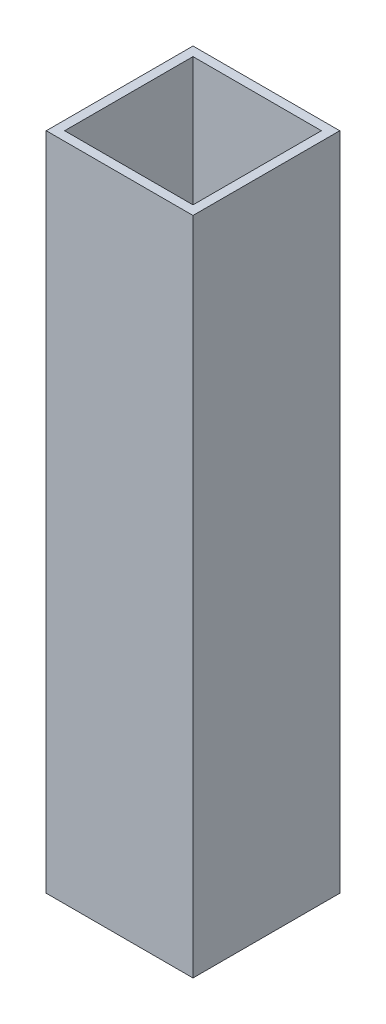
ISO-10303-21;
HEADER;
FILE_DESCRIPTION(('STEP AP214'),'2;1');
FILE_NAME('part.step','',(''),(''),'','','');
FILE_SCHEMA(('AUTOMOTIVE_DESIGN { 1 0 10303 214 1 1 1 1 }'));
ENDSEC;
DATA;
#1=APPLICATION_CONTEXT('core data for automotive mechanical design processes');
#2=APPLICATION_PROTOCOL_DEFINITION('international standard','automotive_design',2000,#1);
#3=PRODUCT_CONTEXT('',#1,'mechanical');
#4=PRODUCT('Part','Part','',(#3));
#5=PRODUCT_RELATED_PRODUCT_CATEGORY('part','',(#4));
#6=PRODUCT_DEFINITION_FORMATION('','',#4);
#7=PRODUCT_DEFINITION_CONTEXT('part definition',#1,'design');
#8=PRODUCT_DEFINITION('design','',#6,#7);
#9=PRODUCT_DEFINITION_SHAPE('','',#8);
#10=(LENGTH_UNIT() NAMED_UNIT(*) SI_UNIT(.MILLI.,.METRE.));
#11=(NAMED_UNIT(*) PLANE_ANGLE_UNIT() SI_UNIT($,.RADIAN.));
#12=(NAMED_UNIT(*) SI_UNIT($,.STERADIAN.) SOLID_ANGLE_UNIT());
#13=UNCERTAINTY_MEASURE_WITH_UNIT(LENGTH_MEASURE(1.E-05),#10,'distance_accuracy_value','');
#14=(GEOMETRIC_REPRESENTATION_CONTEXT(3) GLOBAL_UNCERTAINTY_ASSIGNED_CONTEXT((#13)) GLOBAL_UNIT_ASSIGNED_CONTEXT((#10,
#11,#12)) REPRESENTATION_CONTEXT('',''));
#15=CARTESIAN_POINT('',(0.,0.,0.));
#16=DIRECTION('',(0.,0.,1.));
#17=DIRECTION('',(1.,0.,0.));
#18=AXIS2_PLACEMENT_3D('',#15,#16,#17);
#19=CARTESIAN_POINT('',(0.,114.3,0.));
#20=DIRECTION('',(0.,-1.,0.));
#21=DIRECTION('',(0.,0.,-1.));
#22=AXIS2_PLACEMENT_3D('',#19,#20,#21);
#23=PLANE('',#22);
#24=DIRECTION('',(0.,0.,-1.));
#25=VECTOR('',#24,1.);
#26=CARTESIAN_POINT('',(12.7,114.3,12.7));
#27=LINE('',#26,#25);
#28=CARTESIAN_POINT('',(12.7,114.3,12.7));
#29=VERTEX_POINT('',#28);
#30=CARTESIAN_POINT('',(12.7,114.3,-12.7));
#31=VERTEX_POINT('',#30);
#32=EDGE_CURVE('E135',#29,#31,#27,.T.);
#33=ORIENTED_EDGE('',*,*,#32,.T.);
#34=DIRECTION('',(-1.,0.,0.));
#35=VECTOR('',#34,1.);
#36=CARTESIAN_POINT('',(-12.7,114.3,-12.7));
#37=LINE('',#36,#35);
#38=CARTESIAN_POINT('',(-12.7,114.3,-12.7));
#39=VERTEX_POINT('',#38);
#40=EDGE_CURVE('E138',#31,#39,#37,.T.);
#41=ORIENTED_EDGE('',*,*,#40,.T.);
#42=DIRECTION('',(0.,0.,1.));
#43=VECTOR('',#42,1.);
#44=CARTESIAN_POINT('',(-12.7,114.3,12.7));
#45=LINE('',#44,#43);
#46=CARTESIAN_POINT('',(-12.7,114.3,12.7));
#47=VERTEX_POINT('',#46);
#48=EDGE_CURVE('E141',#39,#47,#45,.T.);
#49=ORIENTED_EDGE('',*,*,#48,.T.);
#50=DIRECTION('',(1.,0.,0.));
#51=VECTOR('',#50,1.);
#52=CARTESIAN_POINT('',(-12.7,114.3,12.7));
#53=LINE('',#52,#51);
#54=EDGE_CURVE('E143',#47,#29,#53,.T.);
#55=ORIENTED_EDGE('',*,*,#54,.T.);
#56=EDGE_LOOP('',(#33,#41,#49,#55));
#57=FACE_BOUND('',#56,.T.);
#58=DIRECTION('',(0.,0.,-1.));
#59=VECTOR('',#58,1.);
#60=CARTESIAN_POINT('',(11.1125,114.3,11.1125));
#61=LINE('',#60,#59);
#62=CARTESIAN_POINT('',(11.1125,114.3,11.1125));
#63=VERTEX_POINT('',#62);
#64=CARTESIAN_POINT('',(11.1125,114.3,-11.1125));
#65=VERTEX_POINT('',#64);
#66=EDGE_CURVE('E99',#63,#65,#61,.T.);
#67=ORIENTED_EDGE('',*,*,#66,.F.);
#68=DIRECTION('',(1.,0.,0.));
#69=VECTOR('',#68,1.);
#70=CARTESIAN_POINT('',(-11.1125,114.3,11.1125));
#71=LINE('',#70,#69);
#72=CARTESIAN_POINT('',(-11.1125,114.3,11.1125));
#73=VERTEX_POINT('',#72);
#74=EDGE_CURVE('E121',#73,#63,#71,.T.);
#75=ORIENTED_EDGE('',*,*,#74,.F.);
#76=DIRECTION('',(0.,0.,1.));
#77=VECTOR('',#76,1.);
#78=CARTESIAN_POINT('',(-11.1125,114.3,11.1125));
#79=LINE('',#78,#77);
#80=CARTESIAN_POINT('',(-11.1125,114.3,-11.1125));
#81=VERTEX_POINT('',#80);
#82=EDGE_CURVE('E119',#81,#73,#79,.T.);
#83=ORIENTED_EDGE('',*,*,#82,.F.);
#84=DIRECTION('',(-1.,0.,0.));
#85=VECTOR('',#84,1.);
#86=CARTESIAN_POINT('',(-11.1125,114.3,-11.1125));
#87=LINE('',#86,#85);
#88=EDGE_CURVE('E107',#65,#81,#87,.T.);
#89=ORIENTED_EDGE('',*,*,#88,.F.);
#90=EDGE_LOOP('',(#67,#75,#83,#89));
#91=FACE_BOUND('',#90,.T.);
#92=ADVANCED_FACE('F34',(#57,#91),#23,.F.);
#93=CARTESIAN_POINT('',(0.,0.,0.));
#94=DIRECTION('',(0.,-1.,0.));
#95=DIRECTION('',(0.,0.,-1.));
#96=AXIS2_PLACEMENT_3D('',#93,#94,#95);
#97=PLANE('',#96);
#98=DIRECTION('',(0.,0.,-1.));
#99=VECTOR('',#98,1.);
#100=CARTESIAN_POINT('',(12.7,0.,12.7));
#101=LINE('',#100,#99);
#102=CARTESIAN_POINT('',(12.7,0.,12.7));
#103=VERTEX_POINT('',#102);
#104=CARTESIAN_POINT('',(12.7,0.,-12.7));
#105=VERTEX_POINT('',#104);
#106=EDGE_CURVE('E115',#103,#105,#101,.T.);
#107=ORIENTED_EDGE('',*,*,#106,.F.);
#108=DIRECTION('',(1.,0.,0.));
#109=VECTOR('',#108,1.);
#110=CARTESIAN_POINT('',(-12.7,0.,12.7));
#111=LINE('',#110,#109);
#112=CARTESIAN_POINT('',(-12.7,0.,12.7));
#113=VERTEX_POINT('',#112);
#114=EDGE_CURVE('E139',#113,#103,#111,.T.);
#115=ORIENTED_EDGE('',*,*,#114,.F.);
#116=DIRECTION('',(0.,0.,1.));
#117=VECTOR('',#116,1.);
#118=CARTESIAN_POINT('',(-12.7,0.,12.7));
#119=LINE('',#118,#117);
#120=CARTESIAN_POINT('',(-12.7,0.,-12.7));
#121=VERTEX_POINT('',#120);
#122=EDGE_CURVE('E150',#121,#113,#119,.T.);
#123=ORIENTED_EDGE('',*,*,#122,.F.);
#124=DIRECTION('',(-1.,0.,0.));
#125=VECTOR('',#124,1.);
#126=CARTESIAN_POINT('',(-12.7,0.,-12.7));
#127=LINE('',#126,#125);
#128=EDGE_CURVE('E148',#105,#121,#127,.T.);
#129=ORIENTED_EDGE('',*,*,#128,.F.);
#130=EDGE_LOOP('',(#107,#115,#123,#129));
#131=FACE_BOUND('',#130,.T.);
#132=DIRECTION('',(1.,0.,0.));
#133=VECTOR('',#132,1.);
#134=CARTESIAN_POINT('',(-11.1125,0.,11.1125));
#135=LINE('',#134,#133);
#136=CARTESIAN_POINT('',(-11.1125,0.,11.1125));
#137=VERTEX_POINT('',#136);
#138=CARTESIAN_POINT('',(11.1125,0.,11.1125));
#139=VERTEX_POINT('',#138);
#140=EDGE_CURVE('E108',#137,#139,#135,.T.);
#141=ORIENTED_EDGE('',*,*,#140,.T.);
#142=DIRECTION('',(0.,0.,-1.));
#143=VECTOR('',#142,1.);
#144=CARTESIAN_POINT('',(11.1125,0.,11.1125));
#145=LINE('',#144,#143);
#146=CARTESIAN_POINT('',(11.1125,0.,-11.1125));
#147=VERTEX_POINT('',#146);
#148=EDGE_CURVE('E57',#139,#147,#145,.T.);
#149=ORIENTED_EDGE('',*,*,#148,.T.);
#150=DIRECTION('',(-1.,0.,0.));
#151=VECTOR('',#150,1.);
#152=CARTESIAN_POINT('',(-11.1125,0.,-11.1125));
#153=LINE('',#152,#151);
#154=CARTESIAN_POINT('',(-11.1125,0.,-11.1125));
#155=VERTEX_POINT('',#154);
#156=EDGE_CURVE('E114',#147,#155,#153,.T.);
#157=ORIENTED_EDGE('',*,*,#156,.T.);
#158=DIRECTION('',(0.,0.,1.));
#159=VECTOR('',#158,1.);
#160=CARTESIAN_POINT('',(-11.1125,0.,11.1125));
#161=LINE('',#160,#159);
#162=EDGE_CURVE('E127',#155,#137,#161,.T.);
#163=ORIENTED_EDGE('',*,*,#162,.T.);
#164=EDGE_LOOP('',(#141,#149,#157,#163));
#165=FACE_BOUND('',#164,.T.);
#166=ADVANCED_FACE('F168',(#131,#165),#97,.T.);
#167=CARTESIAN_POINT('',(12.7,114.3,12.7));
#168=DIRECTION('',(-1.,0.,0.));
#169=DIRECTION('',(0.,0.,1.));
#170=AXIS2_PLACEMENT_3D('',#167,#168,#169);
#171=PLANE('',#170);
#172=ORIENTED_EDGE('',*,*,#106,.T.);
#173=DIRECTION('',(0.,-1.,0.));
#174=VECTOR('',#173,1.);
#175=CARTESIAN_POINT('',(12.7,114.3,-12.7));
#176=LINE('',#175,#174);
#177=EDGE_CURVE('E11',#31,#105,#176,.T.);
#178=ORIENTED_EDGE('',*,*,#177,.F.);
#179=ORIENTED_EDGE('',*,*,#32,.F.);
#180=DIRECTION('',(0.,-1.,0.));
#181=VECTOR('',#180,1.);
#182=CARTESIAN_POINT('',(12.7,114.3,12.7));
#183=LINE('',#182,#181);
#184=EDGE_CURVE('E145',#29,#103,#183,.T.);
#185=ORIENTED_EDGE('',*,*,#184,.T.);
#186=EDGE_LOOP('',(#172,#178,#179,#185));
#187=FACE_BOUND('',#186,.T.);
#188=ADVANCED_FACE('F36',(#187),#171,.F.);
#189=CARTESIAN_POINT('',(-12.7,114.3,-12.7));
#190=DIRECTION('',(0.,0.,1.));
#191=DIRECTION('',(1.,0.,0.));
#192=AXIS2_PLACEMENT_3D('',#189,#190,#191);
#193=PLANE('',#192);
#194=ORIENTED_EDGE('',*,*,#128,.T.);
#195=DIRECTION('',(0.,-1.,0.));
#196=VECTOR('',#195,1.);
#197=CARTESIAN_POINT('',(-12.7,114.3,-12.7));
#198=LINE('',#197,#196);
#199=EDGE_CURVE('E42',#39,#121,#198,.T.);
#200=ORIENTED_EDGE('',*,*,#199,.F.);
#201=ORIENTED_EDGE('',*,*,#40,.F.);
#202=ORIENTED_EDGE('',*,*,#177,.T.);
#203=EDGE_LOOP('',(#194,#200,#201,#202));
#204=FACE_BOUND('',#203,.T.);
#205=ADVANCED_FACE('F178',(#204),#193,.F.);
#206=CARTESIAN_POINT('',(-12.7,114.3,12.7));
#207=DIRECTION('',(1.,0.,0.));
#208=DIRECTION('',(0.,0.,-1.));
#209=AXIS2_PLACEMENT_3D('',#206,#207,#208);
#210=PLANE('',#209);
#211=ORIENTED_EDGE('',*,*,#122,.T.);
#212=DIRECTION('',(0.,-1.,0.));
#213=VECTOR('',#212,1.);
#214=CARTESIAN_POINT('',(-12.7,114.3,12.7));
#215=LINE('',#214,#213);
#216=EDGE_CURVE('E155',#47,#113,#215,.T.);
#217=ORIENTED_EDGE('',*,*,#216,.F.);
#218=ORIENTED_EDGE('',*,*,#48,.F.);
#219=ORIENTED_EDGE('',*,*,#199,.T.);
#220=EDGE_LOOP('',(#211,#217,#218,#219));
#221=FACE_BOUND('',#220,.T.);
#222=ADVANCED_FACE('F162',(#221),#210,.F.);
#223=CARTESIAN_POINT('',(-12.7,114.3,12.7));
#224=DIRECTION('',(0.,0.,-1.));
#225=DIRECTION('',(-1.,0.,0.));
#226=AXIS2_PLACEMENT_3D('',#223,#224,#225);
#227=PLANE('',#226);
#228=ORIENTED_EDGE('',*,*,#114,.T.);
#229=ORIENTED_EDGE('',*,*,#184,.F.);
#230=ORIENTED_EDGE('',*,*,#54,.F.);
#231=ORIENTED_EDGE('',*,*,#216,.T.);
#232=EDGE_LOOP('',(#228,#229,#230,#231));
#233=FACE_BOUND('',#232,.T.);
#234=ADVANCED_FACE('F172',(#233),#227,.F.);
#235=CARTESIAN_POINT('',(11.1125,114.3,11.1125));
#236=DIRECTION('',(-1.,0.,0.));
#237=DIRECTION('',(0.,0.,1.));
#238=AXIS2_PLACEMENT_3D('',#235,#236,#237);
#239=PLANE('',#238);
#240=ORIENTED_EDGE('',*,*,#148,.F.);
#241=DIRECTION('',(0.,-1.,0.));
#242=VECTOR('',#241,1.);
#243=CARTESIAN_POINT('',(11.1125,114.3,11.1125));
#244=LINE('',#243,#242);
#245=EDGE_CURVE('E103',#63,#139,#244,.T.);
#246=ORIENTED_EDGE('',*,*,#245,.F.);
#247=ORIENTED_EDGE('',*,*,#66,.T.);
#248=DIRECTION('',(0.,-1.,0.));
#249=VECTOR('',#248,1.);
#250=CARTESIAN_POINT('',(11.1125,114.3,-11.1125));
#251=LINE('',#250,#249);
#252=EDGE_CURVE('E102',#65,#147,#251,.T.);
#253=ORIENTED_EDGE('',*,*,#252,.T.);
#254=EDGE_LOOP('',(#240,#246,#247,#253));
#255=FACE_BOUND('',#254,.T.);
#256=ADVANCED_FACE('F101',(#255),#239,.T.);
#257=CARTESIAN_POINT('',(-11.1125,114.3,-11.1125));
#258=DIRECTION('',(0.,0.,1.));
#259=DIRECTION('',(1.,0.,0.));
#260=AXIS2_PLACEMENT_3D('',#257,#258,#259);
#261=PLANE('',#260);
#262=ORIENTED_EDGE('',*,*,#156,.F.);
#263=ORIENTED_EDGE('',*,*,#252,.F.);
#264=ORIENTED_EDGE('',*,*,#88,.T.);
#265=DIRECTION('',(0.,-1.,0.));
#266=VECTOR('',#265,1.);
#267=CARTESIAN_POINT('',(-11.1125,114.3,-11.1125));
#268=LINE('',#267,#266);
#269=EDGE_CURVE('E116',#81,#155,#268,.T.);
#270=ORIENTED_EDGE('',*,*,#269,.T.);
#271=EDGE_LOOP('',(#262,#263,#264,#270));
#272=FACE_BOUND('',#271,.T.);
#273=ADVANCED_FACE('F111',(#272),#261,.T.);
#274=CARTESIAN_POINT('',(-11.1125,114.3,11.1125));
#275=DIRECTION('',(1.,0.,0.));
#276=DIRECTION('',(0.,0.,-1.));
#277=AXIS2_PLACEMENT_3D('',#274,#275,#276);
#278=PLANE('',#277);
#279=ORIENTED_EDGE('',*,*,#162,.F.);
#280=ORIENTED_EDGE('',*,*,#269,.F.);
#281=ORIENTED_EDGE('',*,*,#82,.T.);
#282=DIRECTION('',(0.,-1.,0.));
#283=VECTOR('',#282,1.);
#284=CARTESIAN_POINT('',(-11.1125,114.3,11.1125));
#285=LINE('',#284,#283);
#286=EDGE_CURVE('E49',#73,#137,#285,.T.);
#287=ORIENTED_EDGE('',*,*,#286,.T.);
#288=EDGE_LOOP('',(#279,#280,#281,#287));
#289=FACE_BOUND('',#288,.T.);
#290=ADVANCED_FACE('F201',(#289),#278,.T.);
#291=CARTESIAN_POINT('',(-11.1125,114.3,11.1125));
#292=DIRECTION('',(0.,0.,-1.));
#293=DIRECTION('',(-1.,0.,0.));
#294=AXIS2_PLACEMENT_3D('',#291,#292,#293);
#295=PLANE('',#294);
#296=ORIENTED_EDGE('',*,*,#140,.F.);
#297=ORIENTED_EDGE('',*,*,#286,.F.);
#298=ORIENTED_EDGE('',*,*,#74,.T.);
#299=ORIENTED_EDGE('',*,*,#245,.T.);
#300=EDGE_LOOP('',(#296,#297,#298,#299));
#301=FACE_BOUND('',#300,.T.);
#302=ADVANCED_FACE('F205',(#301),#295,.T.);
#303=CLOSED_SHELL('',(#92,#166,#188,#205,#222,#234,#256,#273,#290,#302));
#304=MANIFOLD_SOLID_BREP('B2',#303);
#305=ADVANCED_BREP_SHAPE_REPRESENTATION('',(#18,#304),#14);
#306=SHAPE_DEFINITION_REPRESENTATION(#9,#305);
ENDSEC;
END-ISO-10303-21;
